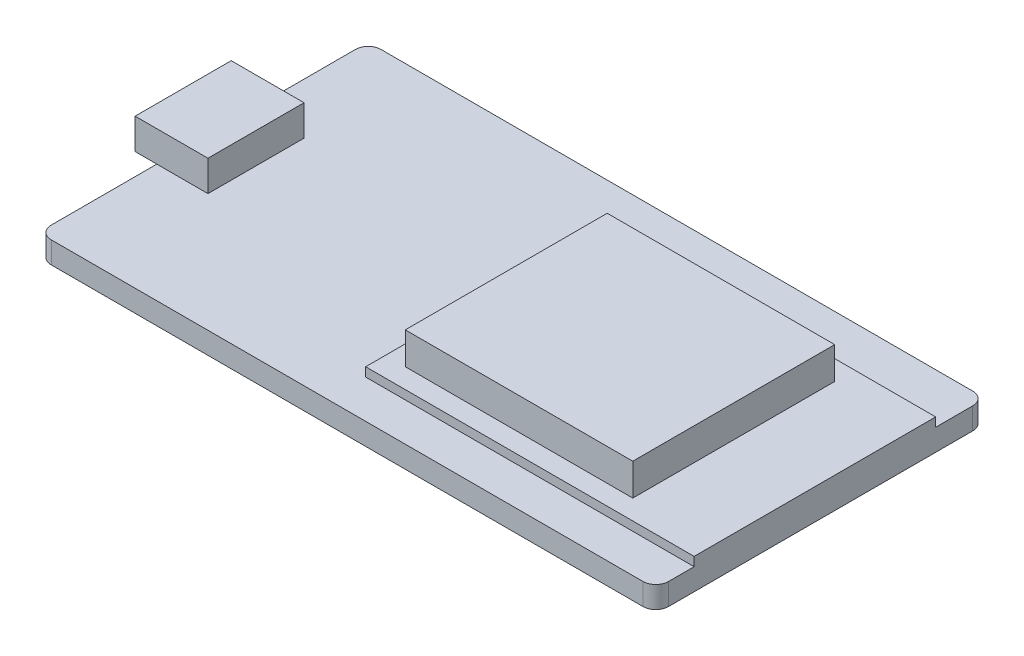
ISO-10303-21;
HEADER;
FILE_DESCRIPTION(('STEP AP214'),'2;1');
FILE_NAME('part.step','',(''),(''),'','','');
FILE_SCHEMA(('AUTOMOTIVE_DESIGN { 1 0 10303 214 1 1 1 1 }'));
ENDSEC;
DATA;
#1=APPLICATION_CONTEXT('core data for automotive mechanical design processes');
#2=APPLICATION_PROTOCOL_DEFINITION('international standard','automotive_design',2000,#1);
#3=PRODUCT_CONTEXT('',#1,'mechanical');
#4=PRODUCT('Part','Part','',(#3));
#5=PRODUCT_RELATED_PRODUCT_CATEGORY('part','',(#4));
#6=PRODUCT_DEFINITION_FORMATION('','',#4);
#7=PRODUCT_DEFINITION_CONTEXT('part definition',#1,'design');
#8=PRODUCT_DEFINITION('design','',#6,#7);
#9=PRODUCT_DEFINITION_SHAPE('','',#8);
#10=(LENGTH_UNIT() NAMED_UNIT(*) SI_UNIT(.MILLI.,.METRE.));
#11=(NAMED_UNIT(*) PLANE_ANGLE_UNIT() SI_UNIT($,.RADIAN.));
#12=(NAMED_UNIT(*) SI_UNIT($,.STERADIAN.) SOLID_ANGLE_UNIT());
#13=UNCERTAINTY_MEASURE_WITH_UNIT(LENGTH_MEASURE(1.E-05),#10,'distance_accuracy_value','');
#14=(GEOMETRIC_REPRESENTATION_CONTEXT(3) GLOBAL_UNCERTAINTY_ASSIGNED_CONTEXT((#13)) GLOBAL_UNIT_ASSIGNED_CONTEXT((#10,
#11,#12)) REPRESENTATION_CONTEXT('',''));
#15=CARTESIAN_POINT('',(0.,0.,0.));
#16=DIRECTION('',(0.,0.,1.));
#17=DIRECTION('',(1.,0.,0.));
#18=AXIS2_PLACEMENT_3D('',#15,#16,#17);
#19=CARTESIAN_POINT('',(0.,1.7,0.));
#20=DIRECTION('',(0.,1.,0.));
#21=DIRECTION('',(0.,0.,1.));
#22=AXIS2_PLACEMENT_3D('',#19,#20,#21);
#23=PLANE('',#22);
#24=DIRECTION('',(1.,0.,0.));
#25=VECTOR('',#24,1.);
#26=CARTESIAN_POINT('',(-24.15,1.7,12.9));
#27=LINE('',#26,#25);
#28=CARTESIAN_POINT('',(-23.15,1.7,12.9));
#29=VERTEX_POINT('',#28);
#30=CARTESIAN_POINT('',(23.15,1.7,12.9));
#31=VERTEX_POINT('',#30);
#32=EDGE_CURVE('E287',#29,#31,#27,.T.);
#33=ORIENTED_EDGE('',*,*,#32,.T.);
#34=CARTESIAN_POINT('',(23.15,1.7,11.9));
#35=DIRECTION('',(0.,1.,0.));
#36=DIRECTION('',(0.,0.,1.));
#37=AXIS2_PLACEMENT_3D('',#34,#35,#36);
#38=CIRCLE('',#37,1.);
#39=CARTESIAN_POINT('',(24.15,1.7,11.9));
#40=VERTEX_POINT('',#39);
#41=EDGE_CURVE('E327',#31,#40,#38,.T.);
#42=ORIENTED_EDGE('',*,*,#41,.T.);
#43=DIRECTION('',(0.,0.,-1.));
#44=VECTOR('',#43,1.);
#45=CARTESIAN_POINT('',(24.15,1.7,-12.9));
#46=LINE('',#45,#44);
#47=CARTESIAN_POINT('',(24.15,1.7,9.9));
#48=VERTEX_POINT('',#47);
#49=EDGE_CURVE('E279',#40,#48,#46,.T.);
#50=ORIENTED_EDGE('',*,*,#49,.T.);
#51=DIRECTION('',(1.,0.,0.));
#52=VECTOR('',#51,1.);
#53=CARTESIAN_POINT('',(24.15,1.7,9.9));
#54=LINE('',#53,#52);
#55=CARTESIAN_POINT('',(-1.54999999999999,1.7,9.90000000000001));
#56=VERTEX_POINT('',#55);
#57=EDGE_CURVE('E253',#56,#48,#54,.T.);
#58=ORIENTED_EDGE('',*,*,#57,.F.);
#59=DIRECTION('',(0.,0.,1.));
#60=VECTOR('',#59,1.);
#61=CARTESIAN_POINT('',(-1.54999999999999,1.7,-8.99999999999999));
#62=LINE('',#61,#60);
#63=CARTESIAN_POINT('',(-1.54999999999999,1.7,-8.99999999999999));
#64=VERTEX_POINT('',#63);
#65=EDGE_CURVE('E262',#64,#56,#62,.T.);
#66=ORIENTED_EDGE('',*,*,#65,.F.);
#67=DIRECTION('',(-1.,0.,0.));
#68=VECTOR('',#67,1.);
#69=CARTESIAN_POINT('',(24.15,1.7,-9.));
#70=LINE('',#69,#68);
#71=CARTESIAN_POINT('',(24.15,1.7,-9.));
#72=VERTEX_POINT('',#71);
#73=EDGE_CURVE('E248',#72,#64,#70,.T.);
#74=ORIENTED_EDGE('',*,*,#73,.F.);
#75=CARTESIAN_POINT('',(24.15,1.7,-11.9));
#76=VERTEX_POINT('',#75);
#77=EDGE_CURVE('E282',#72,#76,#46,.T.);
#78=ORIENTED_EDGE('',*,*,#77,.T.);
#79=CARTESIAN_POINT('',(23.15,1.7,-11.9));
#80=DIRECTION('',(0.,1.,0.));
#81=DIRECTION('',(0.,0.,1.));
#82=AXIS2_PLACEMENT_3D('',#79,#80,#81);
#83=CIRCLE('',#82,1.);
#84=CARTESIAN_POINT('',(23.15,1.7,-12.9));
#85=VERTEX_POINT('',#84);
#86=EDGE_CURVE('E325',#76,#85,#83,.T.);
#87=ORIENTED_EDGE('',*,*,#86,.T.);
#88=DIRECTION('',(-1.,0.,0.));
#89=VECTOR('',#88,1.);
#90=CARTESIAN_POINT('',(-24.15,1.7,-12.9));
#91=LINE('',#90,#89);
#92=CARTESIAN_POINT('',(-23.15,1.7,-12.9));
#93=VERTEX_POINT('',#92);
#94=EDGE_CURVE('E281',#85,#93,#91,.T.);
#95=ORIENTED_EDGE('',*,*,#94,.T.);
#96=CARTESIAN_POINT('',(-23.15,1.7,-11.9));
#97=DIRECTION('',(0.,1.,0.));
#98=DIRECTION('',(0.,0.,1.));
#99=AXIS2_PLACEMENT_3D('',#96,#97,#98);
#100=CIRCLE('',#99,1.);
#101=CARTESIAN_POINT('',(-24.15,1.7,-11.9));
#102=VERTEX_POINT('',#101);
#103=EDGE_CURVE('E54',#93,#102,#100,.T.);
#104=ORIENTED_EDGE('',*,*,#103,.T.);
#105=DIRECTION('',(0.,0.,1.));
#106=VECTOR('',#105,1.);
#107=CARTESIAN_POINT('',(-24.15,1.7,-12.9));
#108=LINE('',#107,#106);
#109=CARTESIAN_POINT('',(-24.15,1.7,-3.88));
#110=VERTEX_POINT('',#109);
#111=EDGE_CURVE('E285',#102,#110,#108,.T.);
#112=ORIENTED_EDGE('',*,*,#111,.T.);
#113=DIRECTION('',(-1.,0.,0.));
#114=VECTOR('',#113,1.);
#115=CARTESIAN_POINT('',(-20.15,1.7,-3.88));
#116=LINE('',#115,#114);
#117=CARTESIAN_POINT('',(-20.15,1.7,-3.88));
#118=VERTEX_POINT('',#117);
#119=EDGE_CURVE('E205',#118,#110,#116,.T.);
#120=ORIENTED_EDGE('',*,*,#119,.F.);
#121=DIRECTION('',(0.,0.,-1.));
#122=VECTOR('',#121,1.);
#123=CARTESIAN_POINT('',(-20.15,1.7,3.64));
#124=LINE('',#123,#122);
#125=CARTESIAN_POINT('',(-20.15,1.7,3.64));
#126=VERTEX_POINT('',#125);
#127=EDGE_CURVE('E390',#126,#118,#124,.T.);
#128=ORIENTED_EDGE('',*,*,#127,.F.);
#129=DIRECTION('',(-1.,0.,0.));
#130=VECTOR('',#129,1.);
#131=CARTESIAN_POINT('',(0.,1.7,3.64));
#132=LINE('',#131,#130);
#133=CARTESIAN_POINT('',(-24.15,1.7,3.64));
#134=VERTEX_POINT('',#133);
#135=EDGE_CURVE('E291',#126,#134,#132,.T.);
#136=ORIENTED_EDGE('',*,*,#135,.T.);
#137=CARTESIAN_POINT('',(-24.15,1.7,11.9));
#138=VERTEX_POINT('',#137);
#139=EDGE_CURVE('E284',#134,#138,#108,.T.);
#140=ORIENTED_EDGE('',*,*,#139,.T.);
#141=CARTESIAN_POINT('',(-23.15,1.7,11.9));
#142=DIRECTION('',(0.,1.,0.));
#143=DIRECTION('',(0.,0.,1.));
#144=AXIS2_PLACEMENT_3D('',#141,#142,#143);
#145=CIRCLE('',#144,1.);
#146=EDGE_CURVE('E322',#138,#29,#145,.T.);
#147=ORIENTED_EDGE('',*,*,#146,.T.);
#148=EDGE_LOOP('',(#33,#42,#50,#58,#66,#74,#78,#87,#95,#104,#112,#120,#128,#136,#140,#147));
#149=FACE_BOUND('',#148,.T.);
#150=ADVANCED_FACE('F39',(#149),#23,.T.);
#151=CARTESIAN_POINT('',(0.,2.4,0.));
#152=DIRECTION('',(0.,-1.,0.));
#153=DIRECTION('',(0.,0.,-1.));
#154=AXIS2_PLACEMENT_3D('',#151,#152,#153);
#155=PLANE('',#154);
#156=DIRECTION('',(0.,0.,-1.));
#157=VECTOR('',#156,1.);
#158=CARTESIAN_POINT('',(24.15,2.4,-9.));
#159=LINE('',#158,#157);
#160=CARTESIAN_POINT('',(24.15,2.4,9.9));
#161=VERTEX_POINT('',#160);
#162=CARTESIAN_POINT('',(24.15,2.4,-9.));
#163=VERTEX_POINT('',#162);
#164=EDGE_CURVE('E249',#161,#163,#159,.T.);
#165=ORIENTED_EDGE('',*,*,#164,.T.);
#166=DIRECTION('',(-1.,0.,0.));
#167=VECTOR('',#166,1.);
#168=CARTESIAN_POINT('',(24.15,2.4,-9.));
#169=LINE('',#168,#167);
#170=CARTESIAN_POINT('',(-1.54999999999999,2.4,-8.99999999999999));
#171=VERTEX_POINT('',#170);
#172=EDGE_CURVE('E252',#163,#171,#169,.T.);
#173=ORIENTED_EDGE('',*,*,#172,.T.);
#174=DIRECTION('',(0.,0.,1.));
#175=VECTOR('',#174,1.);
#176=CARTESIAN_POINT('',(-1.54999999999999,2.4,-8.99999999999999));
#177=LINE('',#176,#175);
#178=CARTESIAN_POINT('',(-1.54999999999999,2.4,9.90000000000001));
#179=VERTEX_POINT('',#178);
#180=EDGE_CURVE('E255',#171,#179,#177,.T.);
#181=ORIENTED_EDGE('',*,*,#180,.T.);
#182=DIRECTION('',(1.,0.,0.));
#183=VECTOR('',#182,1.);
#184=CARTESIAN_POINT('',(24.15,2.4,9.9));
#185=LINE('',#184,#183);
#186=EDGE_CURVE('E257',#179,#161,#185,.T.);
#187=ORIENTED_EDGE('',*,*,#186,.T.);
#188=EDGE_LOOP('',(#165,#173,#181,#187));
#189=FACE_BOUND('',#188,.T.);
#190=DIRECTION('',(0.,0.,-1.));
#191=VECTOR('',#190,1.);
#192=CARTESIAN_POINT('',(17.8,2.4,-7.44999999999999));
#193=LINE('',#192,#191);
#194=CARTESIAN_POINT('',(17.8,2.4,8.35000000000001));
#195=VERTEX_POINT('',#194);
#196=CARTESIAN_POINT('',(17.8,2.4,-7.44999999999999));
#197=VERTEX_POINT('',#196);
#198=EDGE_CURVE('E210',#195,#197,#193,.T.);
#199=ORIENTED_EDGE('',*,*,#198,.F.);
#200=DIRECTION('',(1.,0.,0.));
#201=VECTOR('',#200,1.);
#202=CARTESIAN_POINT('',(0.,2.4,8.35000000000001));
#203=LINE('',#202,#201);
#204=CARTESIAN_POINT('',(0.,2.4,8.35000000000001));
#205=VERTEX_POINT('',#204);
#206=EDGE_CURVE('E223',#205,#195,#203,.T.);
#207=ORIENTED_EDGE('',*,*,#206,.F.);
#208=DIRECTION('',(0.,0.,1.));
#209=VECTOR('',#208,1.);
#210=CARTESIAN_POINT('',(0.,2.4,-7.44999999999999));
#211=LINE('',#210,#209);
#212=CARTESIAN_POINT('',(0.,2.4,-7.44999999999999));
#213=VERTEX_POINT('',#212);
#214=EDGE_CURVE('E232',#213,#205,#211,.T.);
#215=ORIENTED_EDGE('',*,*,#214,.F.);
#216=DIRECTION('',(-1.,0.,0.));
#217=VECTOR('',#216,1.);
#218=CARTESIAN_POINT('',(0.,2.4,-7.44999999999999));
#219=LINE('',#218,#217);
#220=EDGE_CURVE('E213',#197,#213,#219,.T.);
#221=ORIENTED_EDGE('',*,*,#220,.F.);
#222=EDGE_LOOP('',(#199,#207,#215,#221));
#223=FACE_BOUND('',#222,.T.);
#224=ADVANCED_FACE('F414',(#189,#223),#155,.F.);
#225=CARTESIAN_POINT('',(24.15,1.7,-12.9));
#226=DIRECTION('',(-1.,0.,0.));
#227=DIRECTION('',(0.,0.,1.));
#228=AXIS2_PLACEMENT_3D('',#225,#226,#227);
#229=PLANE('',#228);
#230=ORIENTED_EDGE('',*,*,#49,.F.);
#231=DIRECTION('',(0.,-1.,0.));
#232=VECTOR('',#231,1.);
#233=CARTESIAN_POINT('',(24.15,1.7,11.9));
#234=LINE('',#233,#232);
#235=CARTESIAN_POINT('',(24.15,0.,11.9));
#236=VERTEX_POINT('',#235);
#237=EDGE_CURVE('E306',#40,#236,#234,.T.);
#238=ORIENTED_EDGE('',*,*,#237,.T.);
#239=DIRECTION('',(0.,0.,-1.));
#240=VECTOR('',#239,1.);
#241=CARTESIAN_POINT('',(24.15,0.,-12.9));
#242=LINE('',#241,#240);
#243=CARTESIAN_POINT('',(24.15,0.,-11.9));
#244=VERTEX_POINT('',#243);
#245=EDGE_CURVE('E278',#236,#244,#242,.T.);
#246=ORIENTED_EDGE('',*,*,#245,.T.);
#247=DIRECTION('',(0.,-1.,0.));
#248=VECTOR('',#247,1.);
#249=CARTESIAN_POINT('',(24.15,1.7,-11.9));
#250=LINE('',#249,#248);
#251=EDGE_CURVE('E304',#244,#76,#250,.F.);
#252=ORIENTED_EDGE('',*,*,#251,.T.);
#253=ORIENTED_EDGE('',*,*,#77,.F.);
#254=DIRECTION('',(0.,-1.,0.));
#255=VECTOR('',#254,1.);
#256=CARTESIAN_POINT('',(24.15,2.4,-9.));
#257=LINE('',#256,#255);
#258=EDGE_CURVE('E275',#163,#72,#257,.T.);
#259=ORIENTED_EDGE('',*,*,#258,.F.);
#260=ORIENTED_EDGE('',*,*,#164,.F.);
#261=DIRECTION('',(0.,-1.,0.));
#262=VECTOR('',#261,1.);
#263=CARTESIAN_POINT('',(24.15,2.4,9.9));
#264=LINE('',#263,#262);
#265=EDGE_CURVE('E259',#161,#48,#264,.T.);
#266=ORIENTED_EDGE('',*,*,#265,.T.);
#267=EDGE_LOOP('',(#230,#238,#246,#252,#253,#259,#260,#266));
#268=FACE_BOUND('',#267,.T.);
#269=ADVANCED_FACE('F357',(#268),#229,.F.);
#270=CARTESIAN_POINT('',(-24.15,1.7,-12.9));
#271=DIRECTION('',(0.,0.,1.));
#272=DIRECTION('',(1.,0.,0.));
#273=AXIS2_PLACEMENT_3D('',#270,#271,#272);
#274=PLANE('',#273);
#275=ORIENTED_EDGE('',*,*,#94,.F.);
#276=DIRECTION('',(0.,-1.,0.));
#277=VECTOR('',#276,1.);
#278=CARTESIAN_POINT('',(23.15,1.7,-12.9));
#279=LINE('',#278,#277);
#280=CARTESIAN_POINT('',(23.15,0.,-12.9));
#281=VERTEX_POINT('',#280);
#282=EDGE_CURVE('E330',#85,#281,#279,.T.);
#283=ORIENTED_EDGE('',*,*,#282,.T.);
#284=DIRECTION('',(-1.,0.,0.));
#285=VECTOR('',#284,1.);
#286=CARTESIAN_POINT('',(-24.15,0.,-12.9));
#287=LINE('',#286,#285);
#288=CARTESIAN_POINT('',(-23.15,0.,-12.9));
#289=VERTEX_POINT('',#288);
#290=EDGE_CURVE('E294',#281,#289,#287,.T.);
#291=ORIENTED_EDGE('',*,*,#290,.T.);
#292=DIRECTION('',(0.,-1.,0.));
#293=VECTOR('',#292,1.);
#294=CARTESIAN_POINT('',(-23.15,1.7,-12.9));
#295=LINE('',#294,#293);
#296=EDGE_CURVE('E62',#289,#93,#295,.F.);
#297=ORIENTED_EDGE('',*,*,#296,.T.);
#298=EDGE_LOOP('',(#275,#283,#291,#297));
#299=FACE_BOUND('',#298,.T.);
#300=ADVANCED_FACE('F379',(#299),#274,.F.);
#301=CARTESIAN_POINT('',(-24.15,1.7,-12.9));
#302=DIRECTION('',(1.,0.,0.));
#303=DIRECTION('',(0.,0.,-1.));
#304=AXIS2_PLACEMENT_3D('',#301,#302,#303);
#305=PLANE('',#304);
#306=ORIENTED_EDGE('',*,*,#111,.F.);
#307=DIRECTION('',(0.,-1.,0.));
#308=VECTOR('',#307,1.);
#309=CARTESIAN_POINT('',(-24.15,1.7,-11.9));
#310=LINE('',#309,#308);
#311=CARTESIAN_POINT('',(-24.15,0.,-11.9));
#312=VERTEX_POINT('',#311);
#313=EDGE_CURVE('E11',#102,#312,#310,.T.);
#314=ORIENTED_EDGE('',*,*,#313,.T.);
#315=DIRECTION('',(0.,0.,1.));
#316=VECTOR('',#315,1.);
#317=CARTESIAN_POINT('',(-24.15,0.,-12.9));
#318=LINE('',#317,#316);
#319=CARTESIAN_POINT('',(-24.15,0.,11.9));
#320=VERTEX_POINT('',#319);
#321=EDGE_CURVE('E296',#312,#320,#318,.T.);
#322=ORIENTED_EDGE('',*,*,#321,.T.);
#323=DIRECTION('',(0.,-1.,0.));
#324=VECTOR('',#323,1.);
#325=CARTESIAN_POINT('',(-24.15,1.7,11.9));
#326=LINE('',#325,#324);
#327=EDGE_CURVE('E47',#320,#138,#326,.F.);
#328=ORIENTED_EDGE('',*,*,#327,.T.);
#329=ORIENTED_EDGE('',*,*,#139,.F.);
#330=EDGE_CURVE('E288',#110,#134,#108,.T.);
#331=ORIENTED_EDGE('',*,*,#330,.F.);
#332=EDGE_LOOP('',(#306,#314,#322,#328,#329,#331));
#333=FACE_BOUND('',#332,.T.);
#334=ADVANCED_FACE('F336',(#333),#305,.F.);
#335=CARTESIAN_POINT('',(-24.15,1.7,12.9));
#336=DIRECTION('',(0.,0.,-1.));
#337=DIRECTION('',(-1.,0.,0.));
#338=AXIS2_PLACEMENT_3D('',#335,#336,#337);
#339=PLANE('',#338);
#340=DIRECTION('',(1.,0.,0.));
#341=VECTOR('',#340,1.);
#342=CARTESIAN_POINT('',(-24.15,0.,12.9));
#343=LINE('',#342,#341);
#344=CARTESIAN_POINT('',(-23.15,0.,12.9));
#345=VERTEX_POINT('',#344);
#346=CARTESIAN_POINT('',(23.15,0.,12.9));
#347=VERTEX_POINT('',#346);
#348=EDGE_CURVE('E299',#345,#347,#343,.T.);
#349=ORIENTED_EDGE('',*,*,#348,.T.);
#350=DIRECTION('',(0.,-1.,0.));
#351=VECTOR('',#350,1.);
#352=CARTESIAN_POINT('',(23.15,1.7,12.9));
#353=LINE('',#352,#351);
#354=EDGE_CURVE('E320',#347,#31,#353,.F.);
#355=ORIENTED_EDGE('',*,*,#354,.T.);
#356=ORIENTED_EDGE('',*,*,#32,.F.);
#357=DIRECTION('',(0.,-1.,0.));
#358=VECTOR('',#357,1.);
#359=CARTESIAN_POINT('',(-23.15,1.7,12.9));
#360=LINE('',#359,#358);
#361=EDGE_CURVE('E317',#29,#345,#360,.T.);
#362=ORIENTED_EDGE('',*,*,#361,.T.);
#363=EDGE_LOOP('',(#349,#355,#356,#362));
#364=FACE_BOUND('',#363,.T.);
#365=ADVANCED_FACE('F346',(#364),#339,.F.);
#366=CARTESIAN_POINT('',(0.,0.,0.));
#367=DIRECTION('',(0.,1.,0.));
#368=DIRECTION('',(0.,0.,1.));
#369=AXIS2_PLACEMENT_3D('',#366,#367,#368);
#370=PLANE('',#369);
#371=ORIENTED_EDGE('',*,*,#245,.F.);
#372=CARTESIAN_POINT('',(23.15,0.,11.9));
#373=DIRECTION('',(0.,1.,0.));
#374=DIRECTION('',(0.,0.,1.));
#375=AXIS2_PLACEMENT_3D('',#372,#373,#374);
#376=CIRCLE('',#375,1.);
#377=EDGE_CURVE('E315',#236,#347,#376,.F.);
#378=ORIENTED_EDGE('',*,*,#377,.T.);
#379=ORIENTED_EDGE('',*,*,#348,.F.);
#380=CARTESIAN_POINT('',(-23.15,0.,11.9));
#381=DIRECTION('',(0.,1.,0.));
#382=DIRECTION('',(0.,0.,1.));
#383=AXIS2_PLACEMENT_3D('',#380,#381,#382);
#384=CIRCLE('',#383,1.);
#385=EDGE_CURVE('E309',#345,#320,#384,.F.);
#386=ORIENTED_EDGE('',*,*,#385,.T.);
#387=ORIENTED_EDGE('',*,*,#321,.F.);
#388=CARTESIAN_POINT('',(-23.15,0.,-11.9));
#389=DIRECTION('',(0.,1.,0.));
#390=DIRECTION('',(0.,0.,1.));
#391=AXIS2_PLACEMENT_3D('',#388,#389,#390);
#392=CIRCLE('',#391,1.);
#393=EDGE_CURVE('E311',#312,#289,#392,.F.);
#394=ORIENTED_EDGE('',*,*,#393,.T.);
#395=ORIENTED_EDGE('',*,*,#290,.F.);
#396=CARTESIAN_POINT('',(23.15,0.,-11.9));
#397=DIRECTION('',(0.,1.,0.));
#398=DIRECTION('',(0.,0.,1.));
#399=AXIS2_PLACEMENT_3D('',#396,#397,#398);
#400=CIRCLE('',#399,1.);
#401=EDGE_CURVE('E313',#281,#244,#400,.F.);
#402=ORIENTED_EDGE('',*,*,#401,.T.);
#403=EDGE_LOOP('',(#371,#378,#379,#386,#387,#394,#395,#402));
#404=FACE_BOUND('',#403,.T.);
#405=ADVANCED_FACE('F350',(#404),#370,.F.);
#406=CARTESIAN_POINT('',(24.15,2.4,-9.));
#407=DIRECTION('',(0.,0.,1.));
#408=DIRECTION('',(1.,0.,0.));
#409=AXIS2_PLACEMENT_3D('',#406,#407,#408);
#410=PLANE('',#409);
#411=ORIENTED_EDGE('',*,*,#73,.T.);
#412=DIRECTION('',(0.,-1.,0.));
#413=VECTOR('',#412,1.);
#414=CARTESIAN_POINT('',(-1.54999999999999,2.4,-8.99999999999999));
#415=LINE('',#414,#413);
#416=EDGE_CURVE('E272',#171,#64,#415,.T.);
#417=ORIENTED_EDGE('',*,*,#416,.F.);
#418=ORIENTED_EDGE('',*,*,#172,.F.);
#419=ORIENTED_EDGE('',*,*,#258,.T.);
#420=EDGE_LOOP('',(#411,#417,#418,#419));
#421=FACE_BOUND('',#420,.T.);
#422=ADVANCED_FACE('F372',(#421),#410,.F.);
#423=CARTESIAN_POINT('',(-1.54999999999999,2.4,-8.99999999999999));
#424=DIRECTION('',(1.,0.,0.));
#425=DIRECTION('',(0.,0.,-1.));
#426=AXIS2_PLACEMENT_3D('',#423,#424,#425);
#427=PLANE('',#426);
#428=ORIENTED_EDGE('',*,*,#65,.T.);
#429=DIRECTION('',(0.,-1.,0.));
#430=VECTOR('',#429,1.);
#431=CARTESIAN_POINT('',(-1.54999999999999,2.4,9.90000000000001));
#432=LINE('',#431,#430);
#433=EDGE_CURVE('E269',#179,#56,#432,.T.);
#434=ORIENTED_EDGE('',*,*,#433,.F.);
#435=ORIENTED_EDGE('',*,*,#180,.F.);
#436=ORIENTED_EDGE('',*,*,#416,.T.);
#437=EDGE_LOOP('',(#428,#434,#435,#436));
#438=FACE_BOUND('',#437,.T.);
#439=ADVANCED_FACE('F367',(#438),#427,.F.);
#440=CARTESIAN_POINT('',(24.15,2.4,9.9));
#441=DIRECTION('',(0.,0.,-1.));
#442=DIRECTION('',(-1.,0.,0.));
#443=AXIS2_PLACEMENT_3D('',#440,#441,#442);
#444=PLANE('',#443);
#445=ORIENTED_EDGE('',*,*,#57,.T.);
#446=ORIENTED_EDGE('',*,*,#265,.F.);
#447=ORIENTED_EDGE('',*,*,#186,.F.);
#448=ORIENTED_EDGE('',*,*,#433,.T.);
#449=EDGE_LOOP('',(#445,#446,#447,#448));
#450=FACE_BOUND('',#449,.T.);
#451=ADVANCED_FACE('F362',(#450),#444,.F.);
#452=CARTESIAN_POINT('',(17.8,4.9,-7.44999999999999));
#453=DIRECTION('',(-1.,0.,0.));
#454=DIRECTION('',(0.,0.,1.));
#455=AXIS2_PLACEMENT_3D('',#452,#453,#454);
#456=PLANE('',#455);
#457=ORIENTED_EDGE('',*,*,#198,.T.);
#458=DIRECTION('',(0.,-1.,0.));
#459=VECTOR('',#458,1.);
#460=CARTESIAN_POINT('',(17.8,4.9,-7.44999999999999));
#461=LINE('',#460,#459);
#462=CARTESIAN_POINT('',(17.8,4.9,-7.44999999999999));
#463=VERTEX_POINT('',#462);
#464=EDGE_CURVE('E245',#463,#197,#461,.T.);
#465=ORIENTED_EDGE('',*,*,#464,.F.);
#466=DIRECTION('',(0.,0.,-1.));
#467=VECTOR('',#466,1.);
#468=CARTESIAN_POINT('',(17.8,4.9,-7.44999999999999));
#469=LINE('',#468,#467);
#470=CARTESIAN_POINT('',(17.8,4.9,8.35000000000001));
#471=VERTEX_POINT('',#470);
#472=EDGE_CURVE('E219',#471,#463,#469,.T.);
#473=ORIENTED_EDGE('',*,*,#472,.F.);
#474=DIRECTION('',(0.,-1.,0.));
#475=VECTOR('',#474,1.);
#476=CARTESIAN_POINT('',(17.8,4.9,8.35000000000001));
#477=LINE('',#476,#475);
#478=EDGE_CURVE('E228',#471,#195,#477,.T.);
#479=ORIENTED_EDGE('',*,*,#478,.T.);
#480=EDGE_LOOP('',(#457,#465,#473,#479));
#481=FACE_BOUND('',#480,.T.);
#482=ADVANCED_FACE('F536',(#481),#456,.F.);
#483=CARTESIAN_POINT('',(0.,4.9,-7.44999999999999));
#484=DIRECTION('',(0.,0.,1.));
#485=DIRECTION('',(1.,0.,0.));
#486=AXIS2_PLACEMENT_3D('',#483,#484,#485);
#487=PLANE('',#486);
#488=ORIENTED_EDGE('',*,*,#220,.T.);
#489=DIRECTION('',(0.,-1.,0.));
#490=VECTOR('',#489,1.);
#491=CARTESIAN_POINT('',(0.,4.9,-7.44999999999999));
#492=LINE('',#491,#490);
#493=CARTESIAN_POINT('',(0.,4.9,-7.44999999999999));
#494=VERTEX_POINT('',#493);
#495=EDGE_CURVE('E242',#494,#213,#492,.T.);
#496=ORIENTED_EDGE('',*,*,#495,.F.);
#497=DIRECTION('',(-1.,0.,0.));
#498=VECTOR('',#497,1.);
#499=CARTESIAN_POINT('',(0.,4.9,-7.44999999999999));
#500=LINE('',#499,#498);
#501=EDGE_CURVE('E222',#463,#494,#500,.T.);
#502=ORIENTED_EDGE('',*,*,#501,.F.);
#503=ORIENTED_EDGE('',*,*,#464,.T.);
#504=EDGE_LOOP('',(#488,#496,#502,#503));
#505=FACE_BOUND('',#504,.T.);
#506=ADVANCED_FACE('F529',(#505),#487,.F.);
#507=CARTESIAN_POINT('',(0.,4.9,-7.44999999999999));
#508=DIRECTION('',(1.,0.,0.));
#509=DIRECTION('',(0.,0.,-1.));
#510=AXIS2_PLACEMENT_3D('',#507,#508,#509);
#511=PLANE('',#510);
#512=ORIENTED_EDGE('',*,*,#214,.T.);
#513=DIRECTION('',(0.,-1.,0.));
#514=VECTOR('',#513,1.);
#515=CARTESIAN_POINT('',(0.,4.9,8.35000000000001));
#516=LINE('',#515,#514);
#517=CARTESIAN_POINT('',(0.,4.9,8.35000000000001));
#518=VERTEX_POINT('',#517);
#519=EDGE_CURVE('E239',#518,#205,#516,.T.);
#520=ORIENTED_EDGE('',*,*,#519,.F.);
#521=DIRECTION('',(0.,0.,1.));
#522=VECTOR('',#521,1.);
#523=CARTESIAN_POINT('',(0.,4.9,-7.44999999999999));
#524=LINE('',#523,#522);
#525=EDGE_CURVE('E225',#494,#518,#524,.T.);
#526=ORIENTED_EDGE('',*,*,#525,.F.);
#527=ORIENTED_EDGE('',*,*,#495,.T.);
#528=EDGE_LOOP('',(#512,#520,#526,#527));
#529=FACE_BOUND('',#528,.T.);
#530=ADVANCED_FACE('F520',(#529),#511,.F.);
#531=CARTESIAN_POINT('',(0.,4.9,8.35000000000001));
#532=DIRECTION('',(0.,0.,-1.));
#533=DIRECTION('',(-1.,0.,0.));
#534=AXIS2_PLACEMENT_3D('',#531,#532,#533);
#535=PLANE('',#534);
#536=ORIENTED_EDGE('',*,*,#206,.T.);
#537=ORIENTED_EDGE('',*,*,#478,.F.);
#538=DIRECTION('',(1.,0.,0.));
#539=VECTOR('',#538,1.);
#540=CARTESIAN_POINT('',(0.,4.9,8.35000000000001));
#541=LINE('',#540,#539);
#542=EDGE_CURVE('E227',#518,#471,#541,.T.);
#543=ORIENTED_EDGE('',*,*,#542,.F.);
#544=ORIENTED_EDGE('',*,*,#519,.T.);
#545=EDGE_LOOP('',(#536,#537,#543,#544));
#546=FACE_BOUND('',#545,.T.);
#547=ADVANCED_FACE('F512',(#546),#535,.F.);
#548=CARTESIAN_POINT('',(0.,4.9,0.));
#549=DIRECTION('',(0.,1.,0.));
#550=DIRECTION('',(0.,0.,1.));
#551=AXIS2_PLACEMENT_3D('',#548,#549,#550);
#552=PLANE('',#551);
#553=ORIENTED_EDGE('',*,*,#472,.T.);
#554=ORIENTED_EDGE('',*,*,#501,.T.);
#555=ORIENTED_EDGE('',*,*,#525,.T.);
#556=ORIENTED_EDGE('',*,*,#542,.T.);
#557=EDGE_LOOP('',(#553,#554,#555,#556));
#558=FACE_BOUND('',#557,.T.);
#559=ADVANCED_FACE('F502',(#558),#552,.T.);
#560=CARTESIAN_POINT('',(0.,1.7,0.));
#561=DIRECTION('',(0.,1.,0.));
#562=DIRECTION('',(0.,0.,1.));
#563=AXIS2_PLACEMENT_3D('',#560,#561,#562);
#564=PLANE('',#563);
#565=CARTESIAN_POINT('',(-25.85,1.7,-3.88));
#566=VERTEX_POINT('',#565);
#567=EDGE_CURVE('E387',#110,#566,#116,.T.);
#568=ORIENTED_EDGE('',*,*,#567,.F.);
#569=ORIENTED_EDGE('',*,*,#330,.T.);
#570=DIRECTION('',(1.,0.,0.));
#571=VECTOR('',#570,1.);
#572=CARTESIAN_POINT('',(-25.85,1.7,3.64));
#573=LINE('',#572,#571);
#574=CARTESIAN_POINT('',(-25.85,1.7,3.64));
#575=VERTEX_POINT('',#574);
#576=EDGE_CURVE('E402',#575,#134,#573,.T.);
#577=ORIENTED_EDGE('',*,*,#576,.F.);
#578=DIRECTION('',(0.,0.,1.));
#579=VECTOR('',#578,1.);
#580=CARTESIAN_POINT('',(-25.85,1.7,-3.88));
#581=LINE('',#580,#579);
#582=EDGE_CURVE('E209',#566,#575,#581,.T.);
#583=ORIENTED_EDGE('',*,*,#582,.F.);
#584=EDGE_LOOP('',(#568,#569,#577,#583));
#585=FACE_BOUND('',#584,.T.);
#586=ADVANCED_FACE('F388',(#585),#564,.F.);
#587=CARTESIAN_POINT('',(-25.85,4.1,-3.88));
#588=DIRECTION('',(1.,0.,0.));
#589=DIRECTION('',(0.,0.,-1.));
#590=AXIS2_PLACEMENT_3D('',#587,#588,#589);
#591=PLANE('',#590);
#592=ORIENTED_EDGE('',*,*,#582,.T.);
#593=DIRECTION('',(0.,-1.,0.));
#594=VECTOR('',#593,1.);
#595=CARTESIAN_POINT('',(-25.85,4.1,3.64));
#596=LINE('',#595,#594);
#597=CARTESIAN_POINT('',(-25.85,4.1,3.64));
#598=VERTEX_POINT('',#597);
#599=EDGE_CURVE('E189',#598,#575,#596,.T.);
#600=ORIENTED_EDGE('',*,*,#599,.F.);
#601=DIRECTION('',(0.,0.,1.));
#602=VECTOR('',#601,1.);
#603=CARTESIAN_POINT('',(-25.85,4.1,-3.88));
#604=LINE('',#603,#602);
#605=CARTESIAN_POINT('',(-25.85,4.1,-3.88));
#606=VERTEX_POINT('',#605);
#607=EDGE_CURVE('E196',#606,#598,#604,.T.);
#608=ORIENTED_EDGE('',*,*,#607,.F.);
#609=DIRECTION('',(0.,-1.,0.));
#610=VECTOR('',#609,1.);
#611=CARTESIAN_POINT('',(-25.85,4.1,-3.88));
#612=LINE('',#611,#610);
#613=EDGE_CURVE('E398',#606,#566,#612,.T.);
#614=ORIENTED_EDGE('',*,*,#613,.T.);
#615=EDGE_LOOP('',(#592,#600,#608,#614));
#616=FACE_BOUND('',#615,.T.);
#617=ADVANCED_FACE('F207',(#616),#591,.F.);
#618=CARTESIAN_POINT('',(-25.85,4.1,3.64));
#619=DIRECTION('',(0.,0.,-1.));
#620=DIRECTION('',(-1.,0.,0.));
#621=AXIS2_PLACEMENT_3D('',#618,#619,#620);
#622=PLANE('',#621);
#623=ORIENTED_EDGE('',*,*,#576,.T.);
#624=ORIENTED_EDGE('',*,*,#135,.F.);
#625=DIRECTION('',(0.,-1.,0.));
#626=VECTOR('',#625,1.);
#627=CARTESIAN_POINT('',(-20.15,4.1,3.64));
#628=LINE('',#627,#626);
#629=CARTESIAN_POINT('',(-20.15,4.1,3.64));
#630=VERTEX_POINT('',#629);
#631=EDGE_CURVE('E192',#630,#126,#628,.T.);
#632=ORIENTED_EDGE('',*,*,#631,.F.);
#633=DIRECTION('',(1.,0.,0.));
#634=VECTOR('',#633,1.);
#635=CARTESIAN_POINT('',(-25.85,4.1,3.64));
#636=LINE('',#635,#634);
#637=EDGE_CURVE('E184',#598,#630,#636,.T.);
#638=ORIENTED_EDGE('',*,*,#637,.F.);
#639=ORIENTED_EDGE('',*,*,#599,.T.);
#640=EDGE_LOOP('',(#623,#624,#632,#638,#639));
#641=FACE_BOUND('',#640,.T.);
#642=ADVANCED_FACE('F187',(#641),#622,.F.);
#643=CARTESIAN_POINT('',(-20.15,4.1,3.64));
#644=DIRECTION('',(-1.,0.,0.));
#645=DIRECTION('',(0.,0.,1.));
#646=AXIS2_PLACEMENT_3D('',#643,#644,#645);
#647=PLANE('',#646);
#648=ORIENTED_EDGE('',*,*,#127,.T.);
#649=DIRECTION('',(0.,-1.,0.));
#650=VECTOR('',#649,1.);
#651=CARTESIAN_POINT('',(-20.15,4.1,-3.88));
#652=LINE('',#651,#650);
#653=CARTESIAN_POINT('',(-20.15,4.1,-3.88));
#654=VERTEX_POINT('',#653);
#655=EDGE_CURVE('E215',#654,#118,#652,.T.);
#656=ORIENTED_EDGE('',*,*,#655,.F.);
#657=DIRECTION('',(0.,0.,-1.));
#658=VECTOR('',#657,1.);
#659=CARTESIAN_POINT('',(-20.15,4.1,3.64));
#660=LINE('',#659,#658);
#661=EDGE_CURVE('E195',#630,#654,#660,.T.);
#662=ORIENTED_EDGE('',*,*,#661,.F.);
#663=ORIENTED_EDGE('',*,*,#631,.T.);
#664=EDGE_LOOP('',(#648,#656,#662,#663));
#665=FACE_BOUND('',#664,.T.);
#666=ADVANCED_FACE('F404',(#665),#647,.F.);
#667=CARTESIAN_POINT('',(-20.15,4.1,-3.88));
#668=DIRECTION('',(0.,0.,1.));
#669=DIRECTION('',(1.,0.,0.));
#670=AXIS2_PLACEMENT_3D('',#667,#668,#669);
#671=PLANE('',#670);
#672=ORIENTED_EDGE('',*,*,#119,.T.);
#673=ORIENTED_EDGE('',*,*,#567,.T.);
#674=ORIENTED_EDGE('',*,*,#613,.F.);
#675=DIRECTION('',(-1.,0.,0.));
#676=VECTOR('',#675,1.);
#677=CARTESIAN_POINT('',(-20.15,4.1,-3.88));
#678=LINE('',#677,#676);
#679=EDGE_CURVE('E201',#654,#606,#678,.T.);
#680=ORIENTED_EDGE('',*,*,#679,.F.);
#681=ORIENTED_EDGE('',*,*,#655,.T.);
#682=EDGE_LOOP('',(#672,#673,#674,#680,#681));
#683=FACE_BOUND('',#682,.T.);
#684=ADVANCED_FACE('F392',(#683),#671,.F.);
#685=CARTESIAN_POINT('',(0.,4.1,0.));
#686=DIRECTION('',(0.,1.,0.));
#687=DIRECTION('',(0.,0.,1.));
#688=AXIS2_PLACEMENT_3D('',#685,#686,#687);
#689=PLANE('',#688);
#690=ORIENTED_EDGE('',*,*,#607,.T.);
#691=ORIENTED_EDGE('',*,*,#637,.T.);
#692=ORIENTED_EDGE('',*,*,#661,.T.);
#693=ORIENTED_EDGE('',*,*,#679,.T.);
#694=EDGE_LOOP('',(#690,#691,#692,#693));
#695=FACE_BOUND('',#694,.T.);
#696=ADVANCED_FACE('F199',(#695),#689,.T.);
#697=CARTESIAN_POINT('',(23.15,1.7,11.9));
#698=DIRECTION('',(0.,-1.,0.));
#699=DIRECTION('',(0.,0.,-1.));
#700=AXIS2_PLACEMENT_3D('',#697,#698,#699);
#701=CYLINDRICAL_SURFACE('',#700,1.);
#702=ORIENTED_EDGE('',*,*,#41,.F.);
#703=ORIENTED_EDGE('',*,*,#354,.F.);
#704=ORIENTED_EDGE('',*,*,#377,.F.);
#705=ORIENTED_EDGE('',*,*,#237,.F.);
#706=EDGE_LOOP('',(#702,#703,#704,#705));
#707=FACE_BOUND('',#706,.T.);
#708=ADVANCED_FACE('F354',(#707),#701,.T.);
#709=CARTESIAN_POINT('',(23.15,1.7,-11.9));
#710=DIRECTION('',(0.,-1.,0.));
#711=DIRECTION('',(0.,0.,-1.));
#712=AXIS2_PLACEMENT_3D('',#709,#710,#711);
#713=CYLINDRICAL_SURFACE('',#712,1.);
#714=ORIENTED_EDGE('',*,*,#86,.F.);
#715=ORIENTED_EDGE('',*,*,#251,.F.);
#716=ORIENTED_EDGE('',*,*,#401,.F.);
#717=ORIENTED_EDGE('',*,*,#282,.F.);
#718=EDGE_LOOP('',(#714,#715,#716,#717));
#719=FACE_BOUND('',#718,.T.);
#720=ADVANCED_FACE('F377',(#719),#713,.T.);
#721=CARTESIAN_POINT('',(-23.15,1.7,-11.9));
#722=DIRECTION('',(0.,-1.,0.));
#723=DIRECTION('',(0.,0.,-1.));
#724=AXIS2_PLACEMENT_3D('',#721,#722,#723);
#725=CYLINDRICAL_SURFACE('',#724,1.);
#726=ORIENTED_EDGE('',*,*,#103,.F.);
#727=ORIENTED_EDGE('',*,*,#296,.F.);
#728=ORIENTED_EDGE('',*,*,#393,.F.);
#729=ORIENTED_EDGE('',*,*,#313,.F.);
#730=EDGE_LOOP('',(#726,#727,#728,#729));
#731=FACE_BOUND('',#730,.T.);
#732=ADVANCED_FACE('F382',(#731),#725,.T.);
#733=CARTESIAN_POINT('',(-23.15,1.7,11.9));
#734=DIRECTION('',(0.,-1.,0.));
#735=DIRECTION('',(0.,0.,-1.));
#736=AXIS2_PLACEMENT_3D('',#733,#734,#735);
#737=CYLINDRICAL_SURFACE('',#736,1.);
#738=ORIENTED_EDGE('',*,*,#146,.F.);
#739=ORIENTED_EDGE('',*,*,#327,.F.);
#740=ORIENTED_EDGE('',*,*,#385,.F.);
#741=ORIENTED_EDGE('',*,*,#361,.F.);
#742=EDGE_LOOP('',(#738,#739,#740,#741));
#743=FACE_BOUND('',#742,.T.);
#744=ADVANCED_FACE('F41',(#743),#737,.T.);
#745=CLOSED_SHELL('',(#150,#224,#269,#300,#334,#365,#405,#422,#439,#451,#482,#506,#530,#547,
#559,#586,#617,#642,#666,#684,#696,#708,#720,#732,#744));
#746=MANIFOLD_SOLID_BREP('B2',#745);
#747=ADVANCED_BREP_SHAPE_REPRESENTATION('',(#18,#746),#14);
#748=SHAPE_DEFINITION_REPRESENTATION(#9,#747);
ENDSEC;
END-ISO-10303-21;
